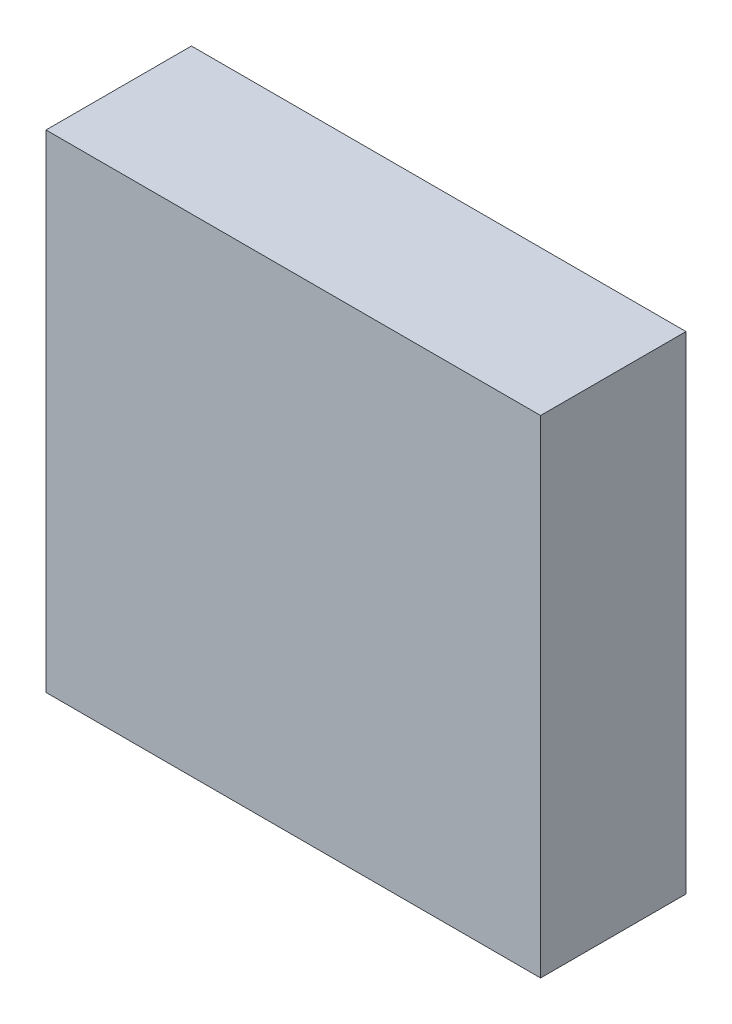
ISO-10303-21;
HEADER;
FILE_DESCRIPTION(('STEP AP214'),'2;1');
FILE_NAME('part.step','',(''),(''),'','','');
FILE_SCHEMA(('AUTOMOTIVE_DESIGN { 1 0 10303 214 1 1 1 1 }'));
ENDSEC;
DATA;
#1=APPLICATION_CONTEXT('core data for automotive mechanical design processes');
#2=APPLICATION_PROTOCOL_DEFINITION('international standard','automotive_design',2000,#1);
#3=PRODUCT_CONTEXT('',#1,'mechanical');
#4=PRODUCT('Part','Part','',(#3));
#5=PRODUCT_RELATED_PRODUCT_CATEGORY('part','',(#4));
#6=PRODUCT_DEFINITION_FORMATION('','',#4);
#7=PRODUCT_DEFINITION_CONTEXT('part definition',#1,'design');
#8=PRODUCT_DEFINITION('design','',#6,#7);
#9=PRODUCT_DEFINITION_SHAPE('','',#8);
#10=(LENGTH_UNIT() NAMED_UNIT(*) SI_UNIT(.MILLI.,.METRE.));
#11=(NAMED_UNIT(*) PLANE_ANGLE_UNIT() SI_UNIT($,.RADIAN.));
#12=(NAMED_UNIT(*) SI_UNIT($,.STERADIAN.) SOLID_ANGLE_UNIT());
#13=UNCERTAINTY_MEASURE_WITH_UNIT(LENGTH_MEASURE(1.E-05),#10,'distance_accuracy_value','');
#14=(GEOMETRIC_REPRESENTATION_CONTEXT(3) GLOBAL_UNCERTAINTY_ASSIGNED_CONTEXT((#13)) GLOBAL_UNIT_ASSIGNED_CONTEXT((#10,
#11,#12)) REPRESENTATION_CONTEXT('',''));
#15=CARTESIAN_POINT('',(0.,0.,0.));
#16=DIRECTION('',(0.,0.,1.));
#17=DIRECTION('',(1.,0.,0.));
#18=AXIS2_PLACEMENT_3D('',#15,#16,#17);
#19=CARTESIAN_POINT('',(-1.75,-1.75,1.));
#20=DIRECTION('',(1.,0.,0.));
#21=DIRECTION('',(0.,0.,-1.));
#22=AXIS2_PLACEMENT_3D('',#19,#20,#21);
#23=PLANE('',#22);
#24=DIRECTION('',(0.,-1.,0.));
#25=VECTOR('',#24,1.);
#26=CARTESIAN_POINT('',(-1.75,-1.75,0.));
#27=LINE('',#26,#25);
#28=CARTESIAN_POINT('',(-1.75,1.6,0.));
#29=VERTEX_POINT('',#28);
#30=CARTESIAN_POINT('',(-1.75,-1.75,0.));
#31=VERTEX_POINT('',#30);
#32=EDGE_CURVE('E95',#29,#31,#27,.T.);
#33=ORIENTED_EDGE('',*,*,#32,.T.);
#34=DIRECTION('',(0.,0.,-1.));
#35=VECTOR('',#34,1.);
#36=CARTESIAN_POINT('',(-1.75,-1.75,1.));
#37=LINE('',#36,#35);
#38=CARTESIAN_POINT('',(-1.75,-1.75,1.));
#39=VERTEX_POINT('',#38);
#40=EDGE_CURVE('E11',#39,#31,#37,.T.);
#41=ORIENTED_EDGE('',*,*,#40,.F.);
#42=DIRECTION('',(0.,-1.,0.));
#43=VECTOR('',#42,1.);
#44=CARTESIAN_POINT('',(-1.75,-1.75,1.));
#45=LINE('',#44,#43);
#46=CARTESIAN_POINT('',(-1.75,1.6,1.));
#47=VERTEX_POINT('',#46);
#48=EDGE_CURVE('E83',#47,#39,#45,.T.);
#49=ORIENTED_EDGE('',*,*,#48,.F.);
#50=DIRECTION('',(0.,0.,-1.));
#51=VECTOR('',#50,1.);
#52=CARTESIAN_POINT('',(-1.75,1.6,1.));
#53=LINE('',#52,#51);
#54=EDGE_CURVE('E91',#47,#29,#53,.T.);
#55=ORIENTED_EDGE('',*,*,#54,.T.);
#56=EDGE_LOOP('',(#33,#41,#49,#55));
#57=FACE_BOUND('',#56,.T.);
#58=ADVANCED_FACE('F32',(#57),#23,.F.);
#59=CARTESIAN_POINT('',(1.651,-1.75,1.));
#60=DIRECTION('',(0.,1.,0.));
#61=DIRECTION('',(0.,0.,1.));
#62=AXIS2_PLACEMENT_3D('',#59,#60,#61);
#63=PLANE('',#62);
#64=DIRECTION('',(1.,0.,0.));
#65=VECTOR('',#64,1.);
#66=CARTESIAN_POINT('',(1.651,-1.75,0.));
#67=LINE('',#66,#65);
#68=CARTESIAN_POINT('',(1.651,-1.75,0.));
#69=VERTEX_POINT('',#68);
#70=EDGE_CURVE('E87',#31,#69,#67,.T.);
#71=ORIENTED_EDGE('',*,*,#70,.T.);
#72=DIRECTION('',(0.,0.,-1.));
#73=VECTOR('',#72,1.);
#74=CARTESIAN_POINT('',(1.651,-1.75,1.));
#75=LINE('',#74,#73);
#76=CARTESIAN_POINT('',(1.651,-1.75,1.));
#77=VERTEX_POINT('',#76);
#78=EDGE_CURVE('E40',#77,#69,#75,.T.);
#79=ORIENTED_EDGE('',*,*,#78,.F.);
#80=DIRECTION('',(1.,0.,0.));
#81=VECTOR('',#80,1.);
#82=CARTESIAN_POINT('',(1.651,-1.75,1.));
#83=LINE('',#82,#81);
#84=EDGE_CURVE('E78',#39,#77,#83,.T.);
#85=ORIENTED_EDGE('',*,*,#84,.F.);
#86=ORIENTED_EDGE('',*,*,#40,.T.);
#87=EDGE_LOOP('',(#71,#79,#85,#86));
#88=FACE_BOUND('',#87,.T.);
#89=ADVANCED_FACE('F86',(#88),#63,.F.);
#90=CARTESIAN_POINT('',(1.651,1.6,1.));
#91=DIRECTION('',(-1.,0.,0.));
#92=DIRECTION('',(0.,0.,1.));
#93=AXIS2_PLACEMENT_3D('',#90,#91,#92);
#94=PLANE('',#93);
#95=DIRECTION('',(0.,1.,0.));
#96=VECTOR('',#95,1.);
#97=CARTESIAN_POINT('',(1.651,1.6,0.));
#98=LINE('',#97,#96);
#99=CARTESIAN_POINT('',(1.651,1.6,0.));
#100=VERTEX_POINT('',#99);
#101=EDGE_CURVE('E65',#69,#100,#98,.T.);
#102=ORIENTED_EDGE('',*,*,#101,.T.);
#103=DIRECTION('',(0.,0.,-1.));
#104=VECTOR('',#103,1.);
#105=CARTESIAN_POINT('',(1.651,1.6,1.));
#106=LINE('',#105,#104);
#107=CARTESIAN_POINT('',(1.651,1.6,1.));
#108=VERTEX_POINT('',#107);
#109=EDGE_CURVE('E88',#108,#100,#106,.T.);
#110=ORIENTED_EDGE('',*,*,#109,.F.);
#111=DIRECTION('',(0.,1.,0.));
#112=VECTOR('',#111,1.);
#113=CARTESIAN_POINT('',(1.651,1.6,1.));
#114=LINE('',#113,#112);
#115=EDGE_CURVE('E81',#77,#108,#114,.T.);
#116=ORIENTED_EDGE('',*,*,#115,.F.);
#117=ORIENTED_EDGE('',*,*,#78,.T.);
#118=EDGE_LOOP('',(#102,#110,#116,#117));
#119=FACE_BOUND('',#118,.T.);
#120=ADVANCED_FACE('F89',(#119),#94,.F.);
#121=CARTESIAN_POINT('',(-1.75,1.6,1.));
#122=DIRECTION('',(0.,-1.,0.));
#123=DIRECTION('',(0.,0.,-1.));
#124=AXIS2_PLACEMENT_3D('',#121,#122,#123);
#125=PLANE('',#124);
#126=DIRECTION('',(-1.,0.,0.));
#127=VECTOR('',#126,1.);
#128=CARTESIAN_POINT('',(-1.75,1.6,0.));
#129=LINE('',#128,#127);
#130=EDGE_CURVE('E71',#100,#29,#129,.T.);
#131=ORIENTED_EDGE('',*,*,#130,.T.);
#132=ORIENTED_EDGE('',*,*,#54,.F.);
#133=DIRECTION('',(-1.,0.,0.));
#134=VECTOR('',#133,1.);
#135=CARTESIAN_POINT('',(-1.75,1.6,1.));
#136=LINE('',#135,#134);
#137=EDGE_CURVE('E48',#108,#47,#136,.T.);
#138=ORIENTED_EDGE('',*,*,#137,.F.);
#139=ORIENTED_EDGE('',*,*,#109,.T.);
#140=EDGE_LOOP('',(#131,#132,#138,#139));
#141=FACE_BOUND('',#140,.T.);
#142=ADVANCED_FACE('F102',(#141),#125,.F.);
#143=CARTESIAN_POINT('',(0.,0.,1.));
#144=DIRECTION('',(0.,0.,-1.));
#145=DIRECTION('',(-1.,0.,0.));
#146=AXIS2_PLACEMENT_3D('',#143,#144,#145);
#147=PLANE('',#146);
#148=ORIENTED_EDGE('',*,*,#48,.T.);
#149=ORIENTED_EDGE('',*,*,#84,.T.);
#150=ORIENTED_EDGE('',*,*,#115,.T.);
#151=ORIENTED_EDGE('',*,*,#137,.T.);
#152=EDGE_LOOP('',(#148,#149,#150,#151));
#153=FACE_BOUND('',#152,.T.);
#154=ADVANCED_FACE('F79',(#153),#147,.F.);
#155=CARTESIAN_POINT('',(0.,0.,0.));
#156=DIRECTION('',(0.,0.,-1.));
#157=DIRECTION('',(-1.,0.,0.));
#158=AXIS2_PLACEMENT_3D('',#155,#156,#157);
#159=PLANE('',#158);
#160=ORIENTED_EDGE('',*,*,#32,.F.);
#161=ORIENTED_EDGE('',*,*,#130,.F.);
#162=ORIENTED_EDGE('',*,*,#101,.F.);
#163=ORIENTED_EDGE('',*,*,#70,.F.);
#164=EDGE_LOOP('',(#160,#161,#162,#163));
#165=FACE_BOUND('',#164,.T.);
#166=ADVANCED_FACE('F105',(#165),#159,.T.);
#167=CLOSED_SHELL('',(#58,#89,#120,#142,#154,#166));
#168=MANIFOLD_SOLID_BREP('B2',#167);
#169=ADVANCED_BREP_SHAPE_REPRESENTATION('',(#18,#168),#14);
#170=SHAPE_DEFINITION_REPRESENTATION(#9,#169);
ENDSEC;
END-ISO-10303-21;
